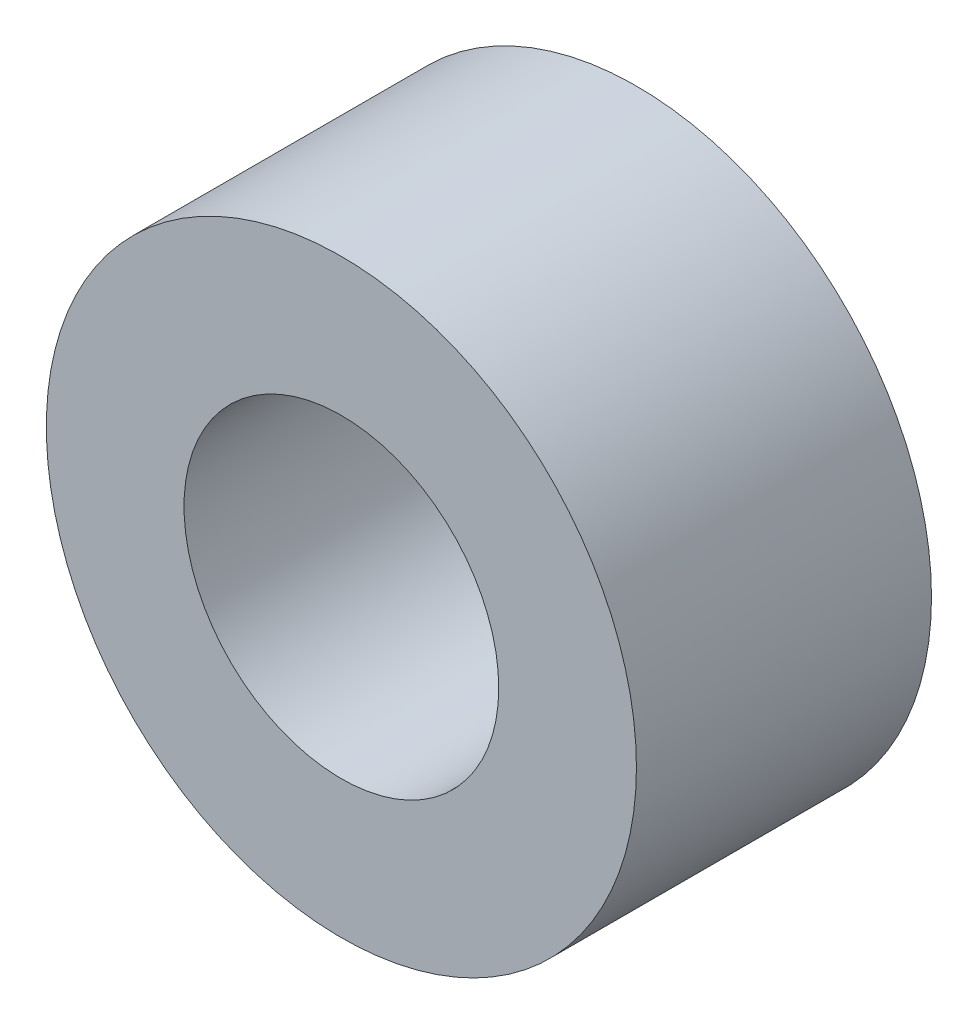
ISO-10303-21;
HEADER;
FILE_DESCRIPTION(('STEP AP214'),'2;1');
FILE_NAME('part.step','',(''),(''),'','','');
FILE_SCHEMA(('AUTOMOTIVE_DESIGN { 1 0 10303 214 1 1 1 1 }'));
ENDSEC;
DATA;
#1=APPLICATION_CONTEXT('core data for automotive mechanical design processes');
#2=APPLICATION_PROTOCOL_DEFINITION('international standard','automotive_design',2000,#1);
#3=PRODUCT_CONTEXT('',#1,'mechanical');
#4=PRODUCT('Part','Part','',(#3));
#5=PRODUCT_RELATED_PRODUCT_CATEGORY('part','',(#4));
#6=PRODUCT_DEFINITION_FORMATION('','',#4);
#7=PRODUCT_DEFINITION_CONTEXT('part definition',#1,'design');
#8=PRODUCT_DEFINITION('design','',#6,#7);
#9=PRODUCT_DEFINITION_SHAPE('','',#8);
#10=(LENGTH_UNIT() NAMED_UNIT(*) SI_UNIT(.MILLI.,.METRE.));
#11=(NAMED_UNIT(*) PLANE_ANGLE_UNIT() SI_UNIT($,.RADIAN.));
#12=(NAMED_UNIT(*) SI_UNIT($,.STERADIAN.) SOLID_ANGLE_UNIT());
#13=UNCERTAINTY_MEASURE_WITH_UNIT(LENGTH_MEASURE(1.E-05),#10,'distance_accuracy_value','');
#14=(GEOMETRIC_REPRESENTATION_CONTEXT(3) GLOBAL_UNCERTAINTY_ASSIGNED_CONTEXT((#13)) GLOBAL_UNIT_ASSIGNED_CONTEXT((#10,
#11,#12)) REPRESENTATION_CONTEXT('',''));
#15=CARTESIAN_POINT('',(0.,0.,0.));
#16=DIRECTION('',(0.,0.,1.));
#17=DIRECTION('',(1.,0.,0.));
#18=AXIS2_PLACEMENT_3D('',#15,#16,#17);
#19=CARTESIAN_POINT('',(0.,0.,3.));
#20=DIRECTION('',(0.,0.,1.));
#21=DIRECTION('',(1.,0.,0.));
#22=AXIS2_PLACEMENT_3D('',#19,#20,#21);
#23=PLANE('',#22);
#24=CARTESIAN_POINT('',(0.,0.,3.));
#25=DIRECTION('',(0.,0.,1.));
#26=DIRECTION('',(1.,0.,0.));
#27=AXIS2_PLACEMENT_3D('',#24,#25,#26);
#28=CIRCLE('',#27,3.);
#29=CARTESIAN_POINT('',(3.,0.,3.));
#30=VERTEX_POINT('',#29);
#31=EDGE_CURVE('E10',#30,#30,#28,.T.);
#32=ORIENTED_EDGE('',*,*,#31,.T.);
#33=EDGE_LOOP('',(#32));
#34=FACE_BOUND('',#33,.T.);
#35=CARTESIAN_POINT('',(0.,0.,3.));
#36=DIRECTION('',(0.,0.,1.));
#37=DIRECTION('',(1.,0.,0.));
#38=AXIS2_PLACEMENT_3D('',#35,#36,#37);
#39=CIRCLE('',#38,1.6);
#40=CARTESIAN_POINT('',(1.6,0.,3.));
#41=VERTEX_POINT('',#40);
#42=EDGE_CURVE('E48',#41,#41,#39,.T.);
#43=ORIENTED_EDGE('',*,*,#42,.F.);
#44=EDGE_LOOP('',(#43));
#45=FACE_BOUND('',#44,.T.);
#46=ADVANCED_FACE('F40',(#34,#45),#23,.T.);
#47=CARTESIAN_POINT('',(0.,0.,0.));
#48=DIRECTION('',(0.,0.,1.));
#49=DIRECTION('',(1.,0.,0.));
#50=AXIS2_PLACEMENT_3D('',#47,#48,#49);
#51=PLANE('',#50);
#52=CARTESIAN_POINT('',(0.,0.,0.));
#53=DIRECTION('',(0.,0.,1.));
#54=DIRECTION('',(1.,0.,0.));
#55=AXIS2_PLACEMENT_3D('',#52,#53,#54);
#56=CIRCLE('',#55,3.);
#57=CARTESIAN_POINT('',(3.,0.,0.));
#58=VERTEX_POINT('',#57);
#59=EDGE_CURVE('E41',#58,#58,#56,.T.);
#60=ORIENTED_EDGE('',*,*,#59,.F.);
#61=EDGE_LOOP('',(#60));
#62=FACE_BOUND('',#61,.T.);
#63=CARTESIAN_POINT('',(0.,0.,0.));
#64=DIRECTION('',(0.,0.,1.));
#65=DIRECTION('',(1.,0.,0.));
#66=AXIS2_PLACEMENT_3D('',#63,#64,#65);
#67=CIRCLE('',#66,1.6);
#68=CARTESIAN_POINT('',(1.6,0.,0.));
#69=VERTEX_POINT('',#68);
#70=EDGE_CURVE('E49',#69,#69,#67,.T.);
#71=ORIENTED_EDGE('',*,*,#70,.T.);
#72=EDGE_LOOP('',(#71));
#73=FACE_BOUND('',#72,.T.);
#74=ADVANCED_FACE('F58',(#62,#73),#51,.F.);
#75=CARTESIAN_POINT('',(0.,0.,3.));
#76=DIRECTION('',(0.,0.,-1.));
#77=DIRECTION('',(-1.,0.,0.));
#78=AXIS2_PLACEMENT_3D('',#75,#76,#77);
#79=CYLINDRICAL_SURFACE('',#78,3.);
#80=ORIENTED_EDGE('',*,*,#31,.F.);
#81=EDGE_LOOP('',(#80));
#82=FACE_BOUND('',#81,.T.);
#83=ORIENTED_EDGE('',*,*,#59,.T.);
#84=EDGE_LOOP('',(#83));
#85=FACE_BOUND('',#84,.T.);
#86=ADVANCED_FACE('F39',(#82,#85),#79,.T.);
#87=CARTESIAN_POINT('',(0.,0.,3.));
#88=DIRECTION('',(0.,0.,-1.));
#89=DIRECTION('',(-1.,0.,0.));
#90=AXIS2_PLACEMENT_3D('',#87,#88,#89);
#91=CYLINDRICAL_SURFACE('',#90,1.6);
#92=ORIENTED_EDGE('',*,*,#42,.T.);
#93=EDGE_LOOP('',(#92));
#94=FACE_BOUND('',#93,.T.);
#95=ORIENTED_EDGE('',*,*,#70,.F.);
#96=EDGE_LOOP('',(#95));
#97=FACE_BOUND('',#96,.T.);
#98=ADVANCED_FACE('F57',(#94,#97),#91,.F.);
#99=CLOSED_SHELL('',(#46,#74,#86,#98));
#100=MANIFOLD_SOLID_BREP('B2',#99);
#101=ADVANCED_BREP_SHAPE_REPRESENTATION('',(#18,#100),#14);
#102=SHAPE_DEFINITION_REPRESENTATION(#9,#101);
ENDSEC;
END-ISO-10303-21;
